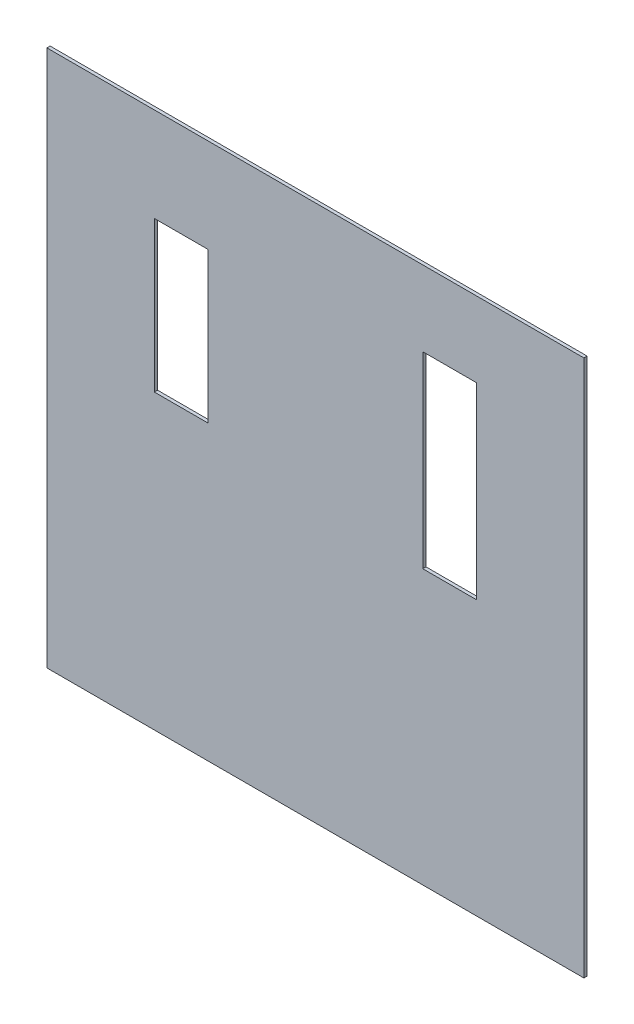
ISO-10303-21;
HEADER;
FILE_DESCRIPTION(('STEP AP214'),'2;1');
FILE_NAME('part.step','',(''),(''),'','','');
FILE_SCHEMA(('AUTOMOTIVE_DESIGN { 1 0 10303 214 1 1 1 1 }'));
ENDSEC;
DATA;
#1=APPLICATION_CONTEXT('core data for automotive mechanical design processes');
#2=APPLICATION_PROTOCOL_DEFINITION('international standard','automotive_design',2000,#1);
#3=PRODUCT_CONTEXT('',#1,'mechanical');
#4=PRODUCT('Part','Part','',(#3));
#5=PRODUCT_RELATED_PRODUCT_CATEGORY('part','',(#4));
#6=PRODUCT_DEFINITION_FORMATION('','',#4);
#7=PRODUCT_DEFINITION_CONTEXT('part definition',#1,'design');
#8=PRODUCT_DEFINITION('design','',#6,#7);
#9=PRODUCT_DEFINITION_SHAPE('','',#8);
#10=(LENGTH_UNIT() NAMED_UNIT(*) SI_UNIT(.MILLI.,.METRE.));
#11=(NAMED_UNIT(*) PLANE_ANGLE_UNIT() SI_UNIT($,.RADIAN.));
#12=(NAMED_UNIT(*) SI_UNIT($,.STERADIAN.) SOLID_ANGLE_UNIT());
#13=UNCERTAINTY_MEASURE_WITH_UNIT(LENGTH_MEASURE(1.E-05),#10,'distance_accuracy_value','');
#14=(GEOMETRIC_REPRESENTATION_CONTEXT(3) GLOBAL_UNCERTAINTY_ASSIGNED_CONTEXT((#13)) GLOBAL_UNIT_ASSIGNED_CONTEXT((#10,
#11,#12)) REPRESENTATION_CONTEXT('',''));
#15=CARTESIAN_POINT('',(0.,0.,0.));
#16=DIRECTION('',(0.,0.,1.));
#17=DIRECTION('',(1.,0.,0.));
#18=AXIS2_PLACEMENT_3D('',#15,#16,#17);
#19=CARTESIAN_POINT('',(0.,0.,0.1524));
#20=DIRECTION('',(1.,0.,0.));
#21=DIRECTION('',(0.,0.,-1.));
#22=AXIS2_PLACEMENT_3D('',#19,#20,#21);
#23=PLANE('',#22);
#24=DIRECTION('',(0.,-1.,0.));
#25=VECTOR('',#24,1.);
#26=CARTESIAN_POINT('',(0.,0.,0.));
#27=LINE('',#26,#25);
#28=CARTESIAN_POINT('',(0.,25.4,0.));
#29=VERTEX_POINT('',#28);
#30=CARTESIAN_POINT('',(0.,0.,0.));
#31=VERTEX_POINT('',#30);
#32=EDGE_CURVE('E183',#29,#31,#27,.T.);
#33=ORIENTED_EDGE('',*,*,#32,.T.);
#34=DIRECTION('',(0.,0.,-1.));
#35=VECTOR('',#34,1.);
#36=CARTESIAN_POINT('',(0.,0.,0.1524));
#37=LINE('',#36,#35);
#38=CARTESIAN_POINT('',(0.,0.,0.1524));
#39=VERTEX_POINT('',#38);
#40=EDGE_CURVE('E11',#39,#31,#37,.T.);
#41=ORIENTED_EDGE('',*,*,#40,.F.);
#42=DIRECTION('',(0.,-1.,0.));
#43=VECTOR('',#42,1.);
#44=CARTESIAN_POINT('',(0.,0.,0.1524));
#45=LINE('',#44,#43);
#46=CARTESIAN_POINT('',(0.,25.4,0.1524));
#47=VERTEX_POINT('',#46);
#48=EDGE_CURVE('E190',#47,#39,#45,.T.);
#49=ORIENTED_EDGE('',*,*,#48,.F.);
#50=DIRECTION('',(0.,0.,-1.));
#51=VECTOR('',#50,1.);
#52=CARTESIAN_POINT('',(0.,25.4,0.1524));
#53=LINE('',#52,#51);
#54=EDGE_CURVE('E200',#47,#29,#53,.T.);
#55=ORIENTED_EDGE('',*,*,#54,.T.);
#56=EDGE_LOOP('',(#33,#41,#49,#55));
#57=FACE_BOUND('',#56,.T.);
#58=ADVANCED_FACE('F33',(#57),#23,.F.);
#59=CARTESIAN_POINT('',(0.,0.,0.1524));
#60=DIRECTION('',(0.,1.,0.));
#61=DIRECTION('',(0.,0.,1.));
#62=AXIS2_PLACEMENT_3D('',#59,#60,#61);
#63=PLANE('',#62);
#64=DIRECTION('',(1.,0.,0.));
#65=VECTOR('',#64,1.);
#66=CARTESIAN_POINT('',(0.,0.,0.));
#67=LINE('',#66,#65);
#68=CARTESIAN_POINT('',(25.4,0.,0.));
#69=VERTEX_POINT('',#68);
#70=EDGE_CURVE('E203',#31,#69,#67,.T.);
#71=ORIENTED_EDGE('',*,*,#70,.T.);
#72=DIRECTION('',(0.,0.,-1.));
#73=VECTOR('',#72,1.);
#74=CARTESIAN_POINT('',(25.4,0.,0.1524));
#75=LINE('',#74,#73);
#76=CARTESIAN_POINT('',(25.4,0.,0.1524));
#77=VERTEX_POINT('',#76);
#78=EDGE_CURVE('E40',#77,#69,#75,.T.);
#79=ORIENTED_EDGE('',*,*,#78,.F.);
#80=DIRECTION('',(1.,0.,0.));
#81=VECTOR('',#80,1.);
#82=CARTESIAN_POINT('',(0.,0.,0.1524));
#83=LINE('',#82,#81);
#84=EDGE_CURVE('E193',#39,#77,#83,.T.);
#85=ORIENTED_EDGE('',*,*,#84,.F.);
#86=ORIENTED_EDGE('',*,*,#40,.T.);
#87=EDGE_LOOP('',(#71,#79,#85,#86));
#88=FACE_BOUND('',#87,.T.);
#89=ADVANCED_FACE('F232',(#88),#63,.F.);
#90=CARTESIAN_POINT('',(25.4,0.,0.1524));
#91=DIRECTION('',(-1.,0.,0.));
#92=DIRECTION('',(0.,0.,1.));
#93=AXIS2_PLACEMENT_3D('',#90,#91,#92);
#94=PLANE('',#93);
#95=DIRECTION('',(0.,1.,0.));
#96=VECTOR('',#95,1.);
#97=CARTESIAN_POINT('',(25.4,0.,0.));
#98=LINE('',#97,#96);
#99=CARTESIAN_POINT('',(25.4,25.4,0.));
#100=VERTEX_POINT('',#99);
#101=EDGE_CURVE('E205',#69,#100,#98,.T.);
#102=ORIENTED_EDGE('',*,*,#101,.T.);
#103=DIRECTION('',(0.,0.,-1.));
#104=VECTOR('',#103,1.);
#105=CARTESIAN_POINT('',(25.4,25.4,0.1524));
#106=LINE('',#105,#104);
#107=CARTESIAN_POINT('',(25.4,25.4,0.1524));
#108=VERTEX_POINT('',#107);
#109=EDGE_CURVE('E210',#108,#100,#106,.T.);
#110=ORIENTED_EDGE('',*,*,#109,.F.);
#111=DIRECTION('',(0.,1.,0.));
#112=VECTOR('',#111,1.);
#113=CARTESIAN_POINT('',(25.4,0.,0.1524));
#114=LINE('',#113,#112);
#115=EDGE_CURVE('E196',#77,#108,#114,.T.);
#116=ORIENTED_EDGE('',*,*,#115,.F.);
#117=ORIENTED_EDGE('',*,*,#78,.T.);
#118=EDGE_LOOP('',(#102,#110,#116,#117));
#119=FACE_BOUND('',#118,.T.);
#120=ADVANCED_FACE('F217',(#119),#94,.F.);
#121=CARTESIAN_POINT('',(0.,25.4,0.1524));
#122=DIRECTION('',(0.,-1.,0.));
#123=DIRECTION('',(0.,0.,-1.));
#124=AXIS2_PLACEMENT_3D('',#121,#122,#123);
#125=PLANE('',#124);
#126=DIRECTION('',(-1.,0.,0.));
#127=VECTOR('',#126,1.);
#128=CARTESIAN_POINT('',(0.,25.4,0.));
#129=LINE('',#128,#127);
#130=EDGE_CURVE('E194',#100,#29,#129,.T.);
#131=ORIENTED_EDGE('',*,*,#130,.T.);
#132=ORIENTED_EDGE('',*,*,#54,.F.);
#133=DIRECTION('',(-1.,0.,0.));
#134=VECTOR('',#133,1.);
#135=CARTESIAN_POINT('',(0.,25.4,0.1524));
#136=LINE('',#135,#134);
#137=EDGE_CURVE('E198',#108,#47,#136,.T.);
#138=ORIENTED_EDGE('',*,*,#137,.F.);
#139=ORIENTED_EDGE('',*,*,#109,.T.);
#140=EDGE_LOOP('',(#131,#132,#138,#139));
#141=FACE_BOUND('',#140,.T.);
#142=ADVANCED_FACE('F225',(#141),#125,.F.);
#143=CARTESIAN_POINT('',(0.,0.,0.1524));
#144=DIRECTION('',(0.,0.,-1.));
#145=DIRECTION('',(-1.,0.,0.));
#146=AXIS2_PLACEMENT_3D('',#143,#144,#145);
#147=PLANE('',#146);
#148=DIRECTION('',(1.,0.,0.));
#149=VECTOR('',#148,1.);
#150=CARTESIAN_POINT('',(17.78,12.954,0.1524));
#151=LINE('',#150,#149);
#152=CARTESIAN_POINT('',(17.78,12.954,0.1524));
#153=VERTEX_POINT('',#152);
#154=CARTESIAN_POINT('',(20.32,12.954,0.1524));
#155=VERTEX_POINT('',#154);
#156=EDGE_CURVE('E148',#153,#155,#151,.T.);
#157=ORIENTED_EDGE('',*,*,#156,.F.);
#158=DIRECTION('',(0.,-1.,0.));
#159=VECTOR('',#158,1.);
#160=CARTESIAN_POINT('',(17.78,21.844,0.1524));
#161=LINE('',#160,#159);
#162=CARTESIAN_POINT('',(17.78,21.844,0.1524));
#163=VERTEX_POINT('',#162);
#164=EDGE_CURVE('E47',#163,#153,#161,.T.);
#165=ORIENTED_EDGE('',*,*,#164,.F.);
#166=DIRECTION('',(-1.,0.,0.));
#167=VECTOR('',#166,1.);
#168=CARTESIAN_POINT('',(17.78,21.844,0.1524));
#169=LINE('',#168,#167);
#170=CARTESIAN_POINT('',(20.32,21.844,0.1524));
#171=VERTEX_POINT('',#170);
#172=EDGE_CURVE('E139',#171,#163,#169,.T.);
#173=ORIENTED_EDGE('',*,*,#172,.F.);
#174=DIRECTION('',(0.,1.,0.));
#175=VECTOR('',#174,1.);
#176=CARTESIAN_POINT('',(20.32,21.844,0.1524));
#177=LINE('',#176,#175);
#178=EDGE_CURVE('E142',#155,#171,#177,.T.);
#179=ORIENTED_EDGE('',*,*,#178,.F.);
#180=EDGE_LOOP('',(#157,#165,#173,#179));
#181=FACE_BOUND('',#180,.T.);
#182=DIRECTION('',(1.,0.,0.));
#183=VECTOR('',#182,1.);
#184=CARTESIAN_POINT('',(5.08,13.843,0.1524));
#185=LINE('',#184,#183);
#186=CARTESIAN_POINT('',(5.08,13.843,0.1524));
#187=VERTEX_POINT('',#186);
#188=CARTESIAN_POINT('',(7.62,13.843,0.1524));
#189=VERTEX_POINT('',#188);
#190=EDGE_CURVE('E173',#187,#189,#185,.T.);
#191=ORIENTED_EDGE('',*,*,#190,.F.);
#192=DIRECTION('',(0.,-1.,0.));
#193=VECTOR('',#192,1.);
#194=CARTESIAN_POINT('',(5.08,20.955,0.1524));
#195=LINE('',#194,#193);
#196=CARTESIAN_POINT('',(5.08,20.955,0.1524));
#197=VERTEX_POINT('',#196);
#198=EDGE_CURVE('E154',#197,#187,#195,.T.);
#199=ORIENTED_EDGE('',*,*,#198,.F.);
#200=DIRECTION('',(-1.,0.,0.));
#201=VECTOR('',#200,1.);
#202=CARTESIAN_POINT('',(5.08,20.955,0.1524));
#203=LINE('',#202,#201);
#204=CARTESIAN_POINT('',(7.62,20.955,0.1524));
#205=VERTEX_POINT('',#204);
#206=EDGE_CURVE('E162',#205,#197,#203,.T.);
#207=ORIENTED_EDGE('',*,*,#206,.F.);
#208=DIRECTION('',(0.,1.,0.));
#209=VECTOR('',#208,1.);
#210=CARTESIAN_POINT('',(7.62,20.955,0.1524));
#211=LINE('',#210,#209);
#212=EDGE_CURVE('E176',#189,#205,#211,.T.);
#213=ORIENTED_EDGE('',*,*,#212,.F.);
#214=EDGE_LOOP('',(#191,#199,#207,#213));
#215=FACE_BOUND('',#214,.T.);
#216=ORIENTED_EDGE('',*,*,#48,.T.);
#217=ORIENTED_EDGE('',*,*,#84,.T.);
#218=ORIENTED_EDGE('',*,*,#115,.T.);
#219=ORIENTED_EDGE('',*,*,#137,.T.);
#220=EDGE_LOOP('',(#216,#217,#218,#219));
#221=FACE_BOUND('',#220,.T.);
#222=ADVANCED_FACE('F231',(#181,#215,#221),#147,.F.);
#223=CARTESIAN_POINT('',(0.,0.,0.));
#224=DIRECTION('',(0.,0.,-1.));
#225=DIRECTION('',(-1.,0.,0.));
#226=AXIS2_PLACEMENT_3D('',#223,#224,#225);
#227=PLANE('',#226);
#228=DIRECTION('',(0.,-1.,0.));
#229=VECTOR('',#228,1.);
#230=CARTESIAN_POINT('',(17.78,21.844,0.));
#231=LINE('',#230,#229);
#232=CARTESIAN_POINT('',(17.78,21.844,0.));
#233=VERTEX_POINT('',#232);
#234=CARTESIAN_POINT('',(17.78,12.954,0.));
#235=VERTEX_POINT('',#234);
#236=EDGE_CURVE('E123',#233,#235,#231,.T.);
#237=ORIENTED_EDGE('',*,*,#236,.T.);
#238=DIRECTION('',(1.,0.,0.));
#239=VECTOR('',#238,1.);
#240=CARTESIAN_POINT('',(17.78,12.954,0.));
#241=LINE('',#240,#239);
#242=CARTESIAN_POINT('',(20.32,12.954,0.));
#243=VERTEX_POINT('',#242);
#244=EDGE_CURVE('E132',#235,#243,#241,.T.);
#245=ORIENTED_EDGE('',*,*,#244,.T.);
#246=DIRECTION('',(0.,1.,0.));
#247=VECTOR('',#246,1.);
#248=CARTESIAN_POINT('',(20.32,21.844,0.));
#249=LINE('',#248,#247);
#250=CARTESIAN_POINT('',(20.32,21.844,0.));
#251=VERTEX_POINT('',#250);
#252=EDGE_CURVE('E55',#243,#251,#249,.T.);
#253=ORIENTED_EDGE('',*,*,#252,.T.);
#254=DIRECTION('',(-1.,0.,0.));
#255=VECTOR('',#254,1.);
#256=CARTESIAN_POINT('',(17.78,21.844,0.));
#257=LINE('',#256,#255);
#258=EDGE_CURVE('E129',#251,#233,#257,.T.);
#259=ORIENTED_EDGE('',*,*,#258,.T.);
#260=EDGE_LOOP('',(#237,#245,#253,#259));
#261=FACE_BOUND('',#260,.T.);
#262=DIRECTION('',(0.,-1.,0.));
#263=VECTOR('',#262,1.);
#264=CARTESIAN_POINT('',(5.08,20.955,0.));
#265=LINE('',#264,#263);
#266=CARTESIAN_POINT('',(5.08,20.955,0.));
#267=VERTEX_POINT('',#266);
#268=CARTESIAN_POINT('',(5.08,13.843,0.));
#269=VERTEX_POINT('',#268);
#270=EDGE_CURVE('E158',#267,#269,#265,.T.);
#271=ORIENTED_EDGE('',*,*,#270,.T.);
#272=DIRECTION('',(1.,0.,0.));
#273=VECTOR('',#272,1.);
#274=CARTESIAN_POINT('',(5.08,13.843,0.));
#275=LINE('',#274,#273);
#276=CARTESIAN_POINT('',(7.62,13.843,0.));
#277=VERTEX_POINT('',#276);
#278=EDGE_CURVE('E161',#269,#277,#275,.T.);
#279=ORIENTED_EDGE('',*,*,#278,.T.);
#280=DIRECTION('',(0.,1.,0.));
#281=VECTOR('',#280,1.);
#282=CARTESIAN_POINT('',(7.62,20.955,0.));
#283=LINE('',#282,#281);
#284=CARTESIAN_POINT('',(7.62,20.955,0.));
#285=VERTEX_POINT('',#284);
#286=EDGE_CURVE('E165',#277,#285,#283,.T.);
#287=ORIENTED_EDGE('',*,*,#286,.T.);
#288=DIRECTION('',(-1.,0.,0.));
#289=VECTOR('',#288,1.);
#290=CARTESIAN_POINT('',(5.08,20.955,0.));
#291=LINE('',#290,#289);
#292=EDGE_CURVE('E168',#285,#267,#291,.T.);
#293=ORIENTED_EDGE('',*,*,#292,.T.);
#294=EDGE_LOOP('',(#271,#279,#287,#293));
#295=FACE_BOUND('',#294,.T.);
#296=ORIENTED_EDGE('',*,*,#32,.F.);
#297=ORIENTED_EDGE('',*,*,#130,.F.);
#298=ORIENTED_EDGE('',*,*,#101,.F.);
#299=ORIENTED_EDGE('',*,*,#70,.F.);
#300=EDGE_LOOP('',(#296,#297,#298,#299));
#301=FACE_BOUND('',#300,.T.);
#302=ADVANCED_FACE('F136',(#261,#295,#301),#227,.T.);
#303=CARTESIAN_POINT('',(5.08,20.955,0.));
#304=DIRECTION('',(-1.,0.,0.));
#305=DIRECTION('',(0.,0.,1.));
#306=AXIS2_PLACEMENT_3D('',#303,#304,#305);
#307=PLANE('',#306);
#308=ORIENTED_EDGE('',*,*,#198,.T.);
#309=DIRECTION('',(0.,0.,1.));
#310=VECTOR('',#309,1.);
#311=CARTESIAN_POINT('',(5.08,13.843,0.));
#312=LINE('',#311,#310);
#313=EDGE_CURVE('E171',#269,#187,#312,.T.);
#314=ORIENTED_EDGE('',*,*,#313,.F.);
#315=ORIENTED_EDGE('',*,*,#270,.F.);
#316=DIRECTION('',(0.,0.,1.));
#317=VECTOR('',#316,1.);
#318=CARTESIAN_POINT('',(5.08,20.955,0.));
#319=LINE('',#318,#317);
#320=EDGE_CURVE('E181',#267,#197,#319,.T.);
#321=ORIENTED_EDGE('',*,*,#320,.T.);
#322=EDGE_LOOP('',(#308,#314,#315,#321));
#323=FACE_BOUND('',#322,.T.);
#324=ADVANCED_FACE('F244',(#323),#307,.F.);
#325=CARTESIAN_POINT('',(5.08,20.955,0.));
#326=DIRECTION('',(0.,1.,0.));
#327=DIRECTION('',(0.,0.,1.));
#328=AXIS2_PLACEMENT_3D('',#325,#326,#327);
#329=PLANE('',#328);
#330=ORIENTED_EDGE('',*,*,#206,.T.);
#331=ORIENTED_EDGE('',*,*,#320,.F.);
#332=ORIENTED_EDGE('',*,*,#292,.F.);
#333=DIRECTION('',(0.,0.,1.));
#334=VECTOR('',#333,1.);
#335=CARTESIAN_POINT('',(7.62,20.955,0.));
#336=LINE('',#335,#334);
#337=EDGE_CURVE('E184',#285,#205,#336,.T.);
#338=ORIENTED_EDGE('',*,*,#337,.T.);
#339=EDGE_LOOP('',(#330,#331,#332,#338));
#340=FACE_BOUND('',#339,.T.);
#341=ADVANCED_FACE('F250',(#340),#329,.F.);
#342=CARTESIAN_POINT('',(7.62,20.955,0.));
#343=DIRECTION('',(1.,0.,0.));
#344=DIRECTION('',(0.,1.,0.));
#345=AXIS2_PLACEMENT_3D('',#342,#343,#344);
#346=PLANE('',#345);
#347=ORIENTED_EDGE('',*,*,#212,.T.);
#348=ORIENTED_EDGE('',*,*,#337,.F.);
#349=ORIENTED_EDGE('',*,*,#286,.F.);
#350=DIRECTION('',(0.,0.,1.));
#351=VECTOR('',#350,1.);
#352=CARTESIAN_POINT('',(7.62,13.843,0.));
#353=LINE('',#352,#351);
#354=EDGE_CURVE('E186',#277,#189,#353,.T.);
#355=ORIENTED_EDGE('',*,*,#354,.T.);
#356=EDGE_LOOP('',(#347,#348,#349,#355));
#357=FACE_BOUND('',#356,.T.);
#358=ADVANCED_FACE('F255',(#357),#346,.F.);
#359=CARTESIAN_POINT('',(5.08,13.843,0.));
#360=DIRECTION('',(0.,-1.,0.));
#361=DIRECTION('',(0.,0.,-1.));
#362=AXIS2_PLACEMENT_3D('',#359,#360,#361);
#363=PLANE('',#362);
#364=ORIENTED_EDGE('',*,*,#190,.T.);
#365=ORIENTED_EDGE('',*,*,#354,.F.);
#366=ORIENTED_EDGE('',*,*,#278,.F.);
#367=ORIENTED_EDGE('',*,*,#313,.T.);
#368=EDGE_LOOP('',(#364,#365,#366,#367));
#369=FACE_BOUND('',#368,.T.);
#370=ADVANCED_FACE('F252',(#369),#363,.F.);
#371=CARTESIAN_POINT('',(17.78,21.844,0.));
#372=DIRECTION('',(-1.,0.,0.));
#373=DIRECTION('',(0.,-1.,0.));
#374=AXIS2_PLACEMENT_3D('',#371,#372,#373);
#375=PLANE('',#374);
#376=ORIENTED_EDGE('',*,*,#164,.T.);
#377=DIRECTION('',(0.,0.,1.));
#378=VECTOR('',#377,1.);
#379=CARTESIAN_POINT('',(17.78,12.954,0.));
#380=LINE('',#379,#378);
#381=EDGE_CURVE('E119',#235,#153,#380,.T.);
#382=ORIENTED_EDGE('',*,*,#381,.F.);
#383=ORIENTED_EDGE('',*,*,#236,.F.);
#384=DIRECTION('',(0.,0.,1.));
#385=VECTOR('',#384,1.);
#386=CARTESIAN_POINT('',(17.78,21.844,0.));
#387=LINE('',#386,#385);
#388=EDGE_CURVE('E152',#233,#163,#387,.T.);
#389=ORIENTED_EDGE('',*,*,#388,.T.);
#390=EDGE_LOOP('',(#376,#382,#383,#389));
#391=FACE_BOUND('',#390,.T.);
#392=ADVANCED_FACE('F121',(#391),#375,.F.);
#393=CARTESIAN_POINT('',(17.78,21.844,0.));
#394=DIRECTION('',(0.,1.,0.));
#395=DIRECTION('',(-1.,0.,0.));
#396=AXIS2_PLACEMENT_3D('',#393,#394,#395);
#397=PLANE('',#396);
#398=ORIENTED_EDGE('',*,*,#172,.T.);
#399=ORIENTED_EDGE('',*,*,#388,.F.);
#400=ORIENTED_EDGE('',*,*,#258,.F.);
#401=DIRECTION('',(0.,0.,1.));
#402=VECTOR('',#401,1.);
#403=CARTESIAN_POINT('',(20.32,21.844,0.));
#404=LINE('',#403,#402);
#405=EDGE_CURVE('E155',#251,#171,#404,.T.);
#406=ORIENTED_EDGE('',*,*,#405,.T.);
#407=EDGE_LOOP('',(#398,#399,#400,#406));
#408=FACE_BOUND('',#407,.T.);
#409=ADVANCED_FACE('F265',(#408),#397,.F.);
#410=CARTESIAN_POINT('',(20.32,21.844,0.));
#411=DIRECTION('',(1.,0.,0.));
#412=DIRECTION('',(0.,0.,-1.));
#413=AXIS2_PLACEMENT_3D('',#410,#411,#412);
#414=PLANE('',#413);
#415=ORIENTED_EDGE('',*,*,#178,.T.);
#416=ORIENTED_EDGE('',*,*,#405,.F.);
#417=ORIENTED_EDGE('',*,*,#252,.F.);
#418=DIRECTION('',(0.,0.,1.));
#419=VECTOR('',#418,1.);
#420=CARTESIAN_POINT('',(20.32,12.954,0.));
#421=LINE('',#420,#419);
#422=EDGE_CURVE('E128',#243,#155,#421,.T.);
#423=ORIENTED_EDGE('',*,*,#422,.T.);
#424=EDGE_LOOP('',(#415,#416,#417,#423));
#425=FACE_BOUND('',#424,.T.);
#426=ADVANCED_FACE('F268',(#425),#414,.F.);
#427=CARTESIAN_POINT('',(17.78,12.954,0.));
#428=DIRECTION('',(0.,-1.,0.));
#429=DIRECTION('',(0.,0.,-1.));
#430=AXIS2_PLACEMENT_3D('',#427,#428,#429);
#431=PLANE('',#430);
#432=ORIENTED_EDGE('',*,*,#156,.T.);
#433=ORIENTED_EDGE('',*,*,#422,.F.);
#434=ORIENTED_EDGE('',*,*,#244,.F.);
#435=ORIENTED_EDGE('',*,*,#381,.T.);
#436=EDGE_LOOP('',(#432,#433,#434,#435));
#437=FACE_BOUND('',#436,.T.);
#438=ADVANCED_FACE('F133',(#437),#431,.F.);
#439=CLOSED_SHELL('',(#58,#89,#120,#142,#222,#302,#324,#341,#358,#370,#392,#409,#426,#438));
#440=MANIFOLD_SOLID_BREP('B2',#439);
#441=ADVANCED_BREP_SHAPE_REPRESENTATION('',(#18,#440),#14);
#442=SHAPE_DEFINITION_REPRESENTATION(#9,#441);
ENDSEC;
END-ISO-10303-21;
